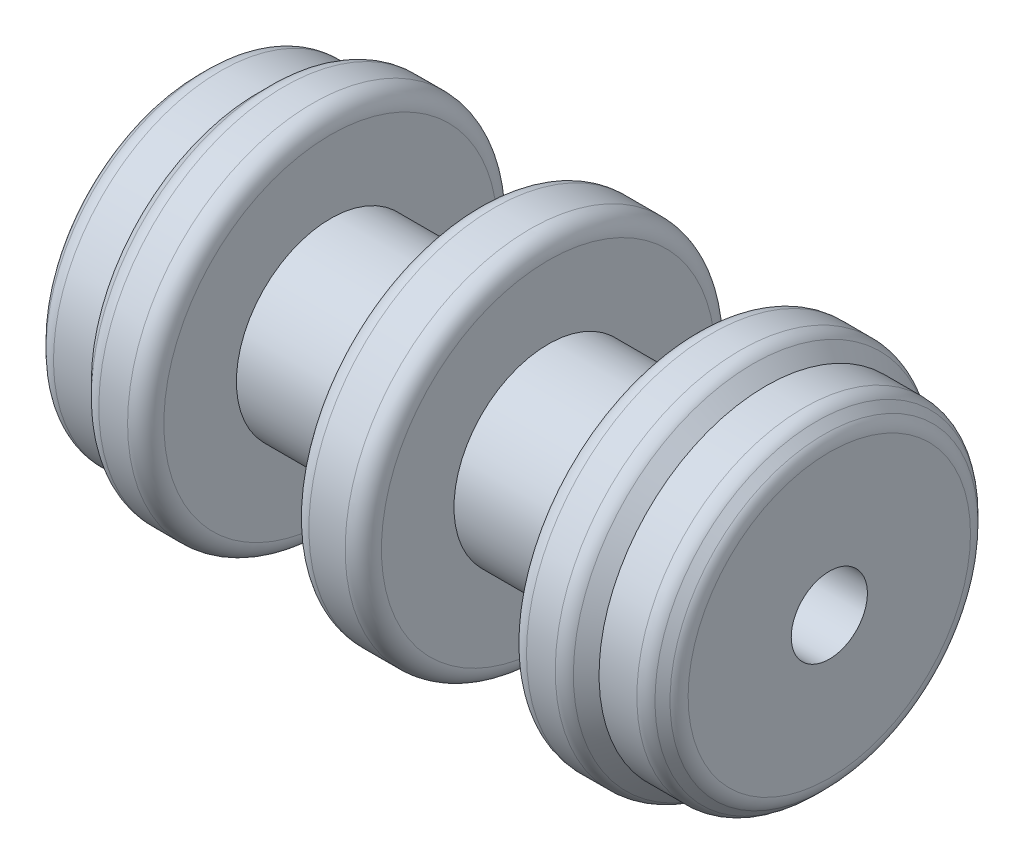
ISO-10303-21;
HEADER;
FILE_DESCRIPTION(('STEP AP214'),'2;1');
FILE_NAME('part.step','',(''),(''),'','','');
FILE_SCHEMA(('AUTOMOTIVE_DESIGN { 1 0 10303 214 1 1 1 1 }'));
ENDSEC;
DATA;
#1=APPLICATION_CONTEXT('core data for automotive mechanical design processes');
#2=APPLICATION_PROTOCOL_DEFINITION('international standard','automotive_design',2000,#1);
#3=PRODUCT_CONTEXT('',#1,'mechanical');
#4=PRODUCT('Part','Part','',(#3));
#5=PRODUCT_RELATED_PRODUCT_CATEGORY('part','',(#4));
#6=PRODUCT_DEFINITION_FORMATION('','',#4);
#7=PRODUCT_DEFINITION_CONTEXT('part definition',#1,'design');
#8=PRODUCT_DEFINITION('design','',#6,#7);
#9=PRODUCT_DEFINITION_SHAPE('','',#8);
#10=(LENGTH_UNIT() NAMED_UNIT(*) SI_UNIT(.MILLI.,.METRE.));
#11=(NAMED_UNIT(*) PLANE_ANGLE_UNIT() SI_UNIT($,.RADIAN.));
#12=(NAMED_UNIT(*) SI_UNIT($,.STERADIAN.) SOLID_ANGLE_UNIT());
#13=UNCERTAINTY_MEASURE_WITH_UNIT(LENGTH_MEASURE(1.E-05),#10,'distance_accuracy_value','');
#14=(GEOMETRIC_REPRESENTATION_CONTEXT(3) GLOBAL_UNCERTAINTY_ASSIGNED_CONTEXT((#13)) GLOBAL_UNIT_ASSIGNED_CONTEXT((#10,
#11,#12)) REPRESENTATION_CONTEXT('',''));
#15=CARTESIAN_POINT('',(0.,0.,0.));
#16=DIRECTION('',(0.,0.,1.));
#17=DIRECTION('',(1.,0.,0.));
#18=AXIS2_PLACEMENT_3D('',#15,#16,#17);
#19=CARTESIAN_POINT('',(-8.25,0.,0.));
#20=DIRECTION('',(1.,0.,0.));
#21=DIRECTION('',(0.,0.,-1.));
#22=AXIS2_PLACEMENT_3D('',#19,#20,#21);
#23=TOROIDAL_SURFACE('',#22,3.892894453143,0.5);
#24=CARTESIAN_POINT('',(-8.60355344197777,0.,0.));
#25=DIRECTION('',(-1.,0.,0.));
#26=DIRECTION('',(0.,-0.999935138433607,-0.0113894216605901));
#27=AXIS2_PLACEMENT_3D('',#24,#25,#26);
#28=CIRCLE('',#27,4.24644779235177);
#29=CARTESIAN_POINT('',(-8.60355344197777,-4.24617236109635,-0.0483645844667762));
#30=VERTEX_POINT('',#29);
#31=EDGE_CURVE('E11',#30,#30,#28,.T.);
#32=ORIENTED_EDGE('',*,*,#31,.T.);
#33=EDGE_LOOP('',(#32));
#34=FACE_BOUND('',#33,.T.);
#35=CARTESIAN_POINT('',(-8.7500000001062,0.0381910115030645,7.7677245975403E-05));
#36=DIRECTION('',(1.,-2.75511514165543E-11,-1.57897898423388E-13));
#37=DIRECTION('',(2.75511482294565E-11,0.999999999797006,-2.01491290041326E-05));
#38=AXIS2_PLACEMENT_3D('',#35,#36,#37);
#39=CIRCLE('',#38,3.85470344242242);
#40=CARTESIAN_POINT('',(-8.75,3.892894453143,8.32904135952587E-09));
#41=VERTEX_POINT('',#40);
#42=CARTESIAN_POINT('',(-8.75,3.89264034580401,0.0443377984638292));
#43=VERTEX_POINT('',#42);
#44=EDGE_CURVE('E258',#41,#43,#39,.T.);
#45=ORIENTED_EDGE('',*,*,#44,.T.);
#46=CARTESIAN_POINT('',(-8.75,-8.09144607978422E-07,8.80616942214307E-07));
#47=DIRECTION('',(1.,0.,0.));
#48=DIRECTION('',(0.,0.999935141035701,0.0113891932072789));
#49=AXIS2_PLACEMENT_3D('',#46,#47,#48);
#50=CIRCLE('',#49,3.89289364399849);
#51=CARTESIAN_POINT('',(-8.75,-3.892894453143,-1.06837358044408E-08));
#52=VERTEX_POINT('',#51);
#53=EDGE_CURVE('E260',#43,#52,#50,.T.);
#54=ORIENTED_EDGE('',*,*,#53,.T.);
#55=CARTESIAN_POINT('',(-8.75000046407109,0.127174847370546,0.00101587679354959));
#56=DIRECTION('',(1.,1.15438382892325E-07,7.82455278567624E-10));
#57=DIRECTION('',(1.15438576935968E-07,-0.999999968070346,-0.000252703963267171));
#58=AXIS2_PLACEMENT_3D('',#55,#56,#57);
#59=CIRCLE('',#58,4.02006942887297);
#60=CARTESIAN_POINT('',(-8.74999999999483,-3.89263873770959,-0.0443377797739686));
#61=VERTEX_POINT('',#60);
#62=EDGE_CURVE('E266',#52,#61,#59,.T.);
#63=ORIENTED_EDGE('',*,*,#62,.T.);
#64=CARTESIAN_POINT('',(-8.75000000069379,2.28907337084926E-06,-0.000119548526096862));
#65=DIRECTION('',(1.,-1.79189333308281E-10,3.15816161693005E-08));
#66=DIRECTION('',(1.79548630367821E-10,-0.999935487778274,-0.0113587095052725));
#67=AXIS2_PLACEMENT_3D('',#64,#65,#66);
#68=CIRCLE('',#67,3.89289216590552);
#69=EDGE_CURVE('E254',#61,#41,#68,.T.);
#70=ORIENTED_EDGE('',*,*,#69,.T.);
#71=EDGE_LOOP('',(#45,#54,#63,#70));
#72=FACE_BOUND('',#71,.T.);
#73=ADVANCED_FACE('F16',(#34,#72),#23,.T.);
#74=CARTESIAN_POINT('',(8.25,0.,0.));
#75=DIRECTION('',(-1.,0.,0.));
#76=DIRECTION('',(0.,0.,1.));
#77=AXIS2_PLACEMENT_3D('',#74,#75,#76);
#78=TOROIDAL_SURFACE('',#77,3.892894321484,0.5);
#79=CARTESIAN_POINT('',(8.60355343649677,0.,0.));
#80=DIRECTION('',(1.,0.,0.));
#81=DIRECTION('',(0.,-0.99993513843578,0.0113894214698698));
#82=AXIS2_PLACEMENT_3D('',#79,#80,#81);
#83=CIRCLE('',#82,4.24644766617377);
#84=CARTESIAN_POINT('',(8.60355343649677,-4.24617223493576,0.0483645822197979));
#85=VERTEX_POINT('',#84);
#86=EDGE_CURVE('E291',#85,#85,#83,.T.);
#87=ORIENTED_EDGE('',*,*,#86,.T.);
#88=EDGE_LOOP('',(#87));
#89=FACE_BOUND('',#88,.T.);
#90=CARTESIAN_POINT('',(8.75,-0.17824437632021,0.00114709993666735));
#91=DIRECTION('',(1.,0.,0.));
#92=DIRECTION('',(0.,0.999937585401855,-0.0111725243659251));
#93=AXIS2_PLACEMENT_3D('',#90,#91,#92);
#94=CIRCLE('',#93,4.0711388594082);
#95=CARTESIAN_POINT('',(8.75,3.89264038459209,-0.0443377981671355));
#96=VERTEX_POINT('',#95);
#97=CARTESIAN_POINT('',(8.75,3.892894321484,5.96614364945702E-09));
#98=VERTEX_POINT('',#97);
#99=EDGE_CURVE('E371',#96,#98,#94,.T.);
#100=ORIENTED_EDGE('',*,*,#99,.F.);
#101=CARTESIAN_POINT('',(8.75,-4.25220619197468E-06,-0.000620433030791134));
#102=DIRECTION('',(1.,0.,0.));
#103=DIRECTION('',(0.,-0.999999987299984,0.000159373872441358));
#104=AXIS2_PLACEMENT_3D('',#101,#102,#103);
#105=CIRCLE('',#104,3.89289011871757);
#106=CARTESIAN_POINT('',(8.75,-3.892894321484,-8.05758241517806E-09));
#107=VERTEX_POINT('',#106);
#108=EDGE_CURVE('E345',#107,#96,#105,.T.);
#109=ORIENTED_EDGE('',*,*,#108,.F.);
#110=CARTESIAN_POINT('',(8.7499998933619,0.14256465399667,-0.00107361043085454));
#111=DIRECTION('',(1.,2.64252571959978E-08,-5.89284578225665E-11));
#112=DIRECTION('',(2.64242471277992E-08,-0.999936681958073,0.0112530917831472));
#113=AXIS2_PLACEMENT_3D('',#110,#111,#112);
#114=CIRCLE('',#113,4.03545911829244);
#115=CARTESIAN_POINT('',(8.74999999999586,-3.89263894692612,0.0443377814144284));
#116=VERTEX_POINT('',#115);
#117=EDGE_CURVE('E341',#116,#107,#114,.T.);
#118=ORIENTED_EDGE('',*,*,#117,.F.);
#119=CARTESIAN_POINT('',(8.74999999999792,4.97456838742527E-06,0.000621040176847112));
#120=DIRECTION('',(1.,-5.33916364426522E-13,-4.48611356518852E-13));
#121=DIRECTION('',(5.33844790482363E-13,0.999999987275025,-0.000159530402088842));
#122=AXIS2_PLACEMENT_3D('',#119,#120,#121);
#123=CIRCLE('',#122,3.89288939645253);
#124=EDGE_CURVE('E319',#98,#116,#123,.T.);
#125=ORIENTED_EDGE('',*,*,#124,.F.);
#126=EDGE_LOOP('',(#100,#109,#118,#125));
#127=FACE_BOUND('',#126,.T.);
#128=ADVANCED_FACE('F528',(#89,#127),#78,.T.);
#129=CARTESIAN_POINT('',(-8.042894513343,0.,0.));
#130=DIRECTION('',(1.,0.,0.));
#131=DIRECTION('',(0.,0.,-1.));
#132=AXIS2_PLACEMENT_3D('',#129,#130,#131);
#133=TOROIDAL_SURFACE('',#132,4.1,0.499999999999992);
#134=CARTESIAN_POINT('',(-8.042894513343,0.,0.));
#135=DIRECTION('',(-1.,0.,0.));
#136=DIRECTION('',(0.,0.999968417387247,-0.00794759259425538));
#137=AXIS2_PLACEMENT_3D('',#134,#135,#136);
#138=CIRCLE('',#137,4.6);
#139=CARTESIAN_POINT('',(-8.042894513343,4.59985471998134,-0.0365589259335747));
#140=VERTEX_POINT('',#139);
#141=EDGE_CURVE('E301',#140,#140,#138,.T.);
#142=ORIENTED_EDGE('',*,*,#141,.T.);
#143=EDGE_LOOP('',(#142));
#144=FACE_BOUND('',#143,.T.);
#145=CARTESIAN_POINT('',(-8.39644795536287,0.,0.));
#146=DIRECTION('',(-1.,0.,0.));
#147=DIRECTION('',(0.,0.,-1.));
#148=AXIS2_PLACEMENT_3D('',#145,#146,#147);
#149=CIRCLE('',#148,4.45355333920361);
#150=CARTESIAN_POINT('',(-8.39644795536287,0.,-4.45355333920361));
#151=VERTEX_POINT('',#150);
#152=EDGE_CURVE('E27',#151,#151,#149,.T.);
#153=ORIENTED_EDGE('',*,*,#152,.F.);
#154=EDGE_LOOP('',(#153));
#155=FACE_BOUND('',#154,.T.);
#156=ADVANCED_FACE('F522',(#144,#155),#133,.T.);
#157=CARTESIAN_POINT('',(8.042894375263,0.,0.));
#158=DIRECTION('',(1.,0.,0.));
#159=DIRECTION('',(0.,0.,-1.));
#160=AXIS2_PLACEMENT_3D('',#157,#158,#159);
#161=TOROIDAL_SURFACE('',#160,4.1,0.5);
#162=CARTESIAN_POINT('',(8.3964478117764,0.,0.));
#163=DIRECTION('',(1.,0.,0.));
#164=DIRECTION('',(0.,0.,-1.));
#165=AXIS2_PLACEMENT_3D('',#162,#163,#164);
#166=CIRCLE('',#165,4.45355334466058);
#167=CARTESIAN_POINT('',(8.3964478117764,0.,-4.45355334466058));
#168=VERTEX_POINT('',#167);
#169=EDGE_CURVE('E293',#168,#168,#166,.T.);
#170=ORIENTED_EDGE('',*,*,#169,.F.);
#171=EDGE_LOOP('',(#170));
#172=FACE_BOUND('',#171,.T.);
#173=CARTESIAN_POINT('',(8.042894375263,0.,0.));
#174=DIRECTION('',(1.,0.,0.));
#175=DIRECTION('',(0.,0.999973425875417,0.00729023614034013));
#176=AXIS2_PLACEMENT_3D('',#173,#174,#175);
#177=CIRCLE('',#176,4.6);
#178=CARTESIAN_POINT('',(8.042894375263,4.59987775902692,0.0335350862455646));
#179=VERTEX_POINT('',#178);
#180=EDGE_CURVE('E217',#179,#179,#177,.T.);
#181=ORIENTED_EDGE('',*,*,#180,.T.);
#182=EDGE_LOOP('',(#181));
#183=FACE_BOUND('',#182,.T.);
#184=ADVANCED_FACE('F527',(#172,#183),#161,.T.);
#185=CARTESIAN_POINT('',(-6.292893218813,0.,0.));
#186=DIRECTION('',(1.,0.,0.));
#187=DIRECTION('',(0.,0.,-1.));
#188=AXIS2_PLACEMENT_3D('',#185,#186,#187);
#189=TOROIDAL_SURFACE('',#188,4.6,0.500000000000008);
#190=CARTESIAN_POINT('',(-6.292893218813,0.,0.));
#191=DIRECTION('',(-1.,0.,0.));
#192=DIRECTION('',(0.,-0.999976094856996,-0.00691445692387086));
#193=AXIS2_PLACEMENT_3D('',#190,#191,#192);
#194=CIRCLE('',#193,5.1);
#195=CARTESIAN_POINT('',(-6.292893218813,-5.09987808377068,-0.0352637303117414));
#196=VERTEX_POINT('',#195);
#197=EDGE_CURVE('E107',#196,#196,#194,.T.);
#198=ORIENTED_EDGE('',*,*,#197,.T.);
#199=EDGE_LOOP('',(#198));
#200=FACE_BOUND('',#199,.T.);
#201=CARTESIAN_POINT('',(-6.6464466093521,0.,0.));
#202=DIRECTION('',(-1.,0.,0.));
#203=DIRECTION('',(0.,-1.,0.));
#204=AXIS2_PLACEMENT_3D('',#201,#202,#203);
#205=CIRCLE('',#204,4.95355339057824);
#206=CARTESIAN_POINT('',(-6.6464466093521,-4.95355339057824,0.));
#207=VERTEX_POINT('',#206);
#208=EDGE_CURVE('E357',#207,#207,#205,.T.);
#209=ORIENTED_EDGE('',*,*,#208,.F.);
#210=EDGE_LOOP('',(#209));
#211=FACE_BOUND('',#210,.T.);
#212=ADVANCED_FACE('F638',(#200,#211),#189,.T.);
#213=CARTESIAN_POINT('',(6.29289321881301,0.,0.));
#214=DIRECTION('',(1.,0.,0.));
#215=DIRECTION('',(0.,0.,-1.));
#216=AXIS2_PLACEMENT_3D('',#213,#214,#215);
#217=TOROIDAL_SURFACE('',#216,4.6,0.499999999999986);
#218=CARTESIAN_POINT('',(6.6464466093521,0.,0.));
#219=DIRECTION('',(1.,0.,0.));
#220=DIRECTION('',(0.,1.,0.));
#221=AXIS2_PLACEMENT_3D('',#218,#219,#220);
#222=CIRCLE('',#221,4.95355339057824);
#223=CARTESIAN_POINT('',(6.6464466093521,4.95355339057824,0.));
#224=VERTEX_POINT('',#223);
#225=EDGE_CURVE('E312',#224,#224,#222,.T.);
#226=ORIENTED_EDGE('',*,*,#225,.F.);
#227=EDGE_LOOP('',(#226));
#228=FACE_BOUND('',#227,.T.);
#229=CARTESIAN_POINT('',(6.292893218813,0.,0.));
#230=DIRECTION('',(1.,0.,0.));
#231=DIRECTION('',(0.,0.999978381048036,0.00657551796802924));
#232=AXIS2_PLACEMENT_3D('',#229,#230,#231);
#233=CIRCLE('',#232,5.1);
#234=CARTESIAN_POINT('',(6.292893218813,5.09988974334499,0.0335351416369491));
#235=VERTEX_POINT('',#234);
#236=EDGE_CURVE('E351',#235,#235,#233,.T.);
#237=ORIENTED_EDGE('',*,*,#236,.T.);
#238=EDGE_LOOP('',(#237));
#239=FACE_BOUND('',#238,.T.);
#240=ADVANCED_FACE('F632',(#228,#239),#217,.T.);
#241=CARTESIAN_POINT('',(-5.5,0.,0.));
#242=DIRECTION('',(1.,0.,0.));
#243=DIRECTION('',(0.,0.,-1.));
#244=AXIS2_PLACEMENT_3D('',#241,#242,#243);
#245=TOROIDAL_SURFACE('',#244,4.6,0.5);
#246=CARTESIAN_POINT('',(-5.,-8.60639115204433E-07,9.39716608564303E-07));
#247=DIRECTION('',(-1.,0.,0.));
#248=DIRECTION('',(0.,-0.999999999999979,-2.04286257513174E-07));
#249=AXIS2_PLACEMENT_3D('',#246,#247,#248);
#250=CIRCLE('',#249,4.59999913936098);
#251=CARTESIAN_POINT('',(-5.,-4.6,0.));
#252=VERTEX_POINT('',#251);
#253=CARTESIAN_POINT('',(-5.,4.59989883777754,0.0302473713753235));
#254=VERTEX_POINT('',#253);
#255=EDGE_CURVE('E329',#252,#254,#250,.T.);
#256=ORIENTED_EDGE('',*,*,#255,.T.);
#257=CARTESIAN_POINT('',(-4.99999999969179,0.120181614794313,0.000141118722733426));
#258=DIRECTION('',(-1.,-6.88004579931393E-11,-2.30102573919844E-13));
#259=DIRECTION('',(-6.88004507084842E-11,0.999977417735186,0.006720418117189));
#260=AXIS2_PLACEMENT_3D('',#257,#258,#259);
#261=CIRCLE('',#260,4.47981838742838);
#262=CARTESIAN_POINT('',(-5.,4.6,0.));
#263=VERTEX_POINT('',#262);
#264=EDGE_CURVE('E69',#254,#263,#261,.T.);
#265=ORIENTED_EDGE('',*,*,#264,.T.);
#266=CARTESIAN_POINT('',(-4.99999999991786,1.31880826116475E-06,0.000120541578642981));
#267=DIRECTION('',(-1.,-1.77104639971205E-11,5.58131300833015E-09));
#268=DIRECTION('',(-1.78567206157317E-11,0.999999999656657,-2.62046985133696E-05));
#269=AXIS2_PLACEMENT_3D('',#266,#267,#268);
#270=CIRCLE('',#269,4.59999868277112);
#271=CARTESIAN_POINT('',(-5.00000000000588,-4.59989712501686,-0.0302470067458492));
#272=VERTEX_POINT('',#271);
#273=EDGE_CURVE('E55',#263,#272,#270,.T.);
#274=ORIENTED_EDGE('',*,*,#273,.T.);
#275=CARTESIAN_POINT('',(-4.99999931062655,-0.0340611734194487,0.000405821301024528));
#276=DIRECTION('',(-0.999999999999988,1.5098168929867E-07,7.08050913941013E-10));
#277=DIRECTION('',(-1.50983040346389E-07,-0.999977465090659,-0.00671336806953142));
#278=AXIS2_PLACEMENT_3D('',#275,#276,#277);
#279=CIRCLE('',#278,4.56593884461533);
#280=EDGE_CURVE('E360',#272,#252,#279,.T.);
#281=ORIENTED_EDGE('',*,*,#280,.T.);
#282=EDGE_LOOP('',(#256,#265,#274,#281));
#283=FACE_BOUND('',#282,.T.);
#284=CARTESIAN_POINT('',(-5.5,0.,0.));
#285=DIRECTION('',(-1.,0.,0.));
#286=DIRECTION('',(0.,0.,-1.));
#287=AXIS2_PLACEMENT_3D('',#284,#285,#286);
#288=CIRCLE('',#287,5.1);
#289=CARTESIAN_POINT('',(-5.5,0.,-5.1));
#290=VERTEX_POINT('',#289);
#291=EDGE_CURVE('E97',#290,#290,#288,.T.);
#292=ORIENTED_EDGE('',*,*,#291,.F.);
#293=EDGE_LOOP('',(#292));
#294=FACE_BOUND('',#293,.T.);
#295=ADVANCED_FACE('F637',(#283,#294),#245,.T.);
#296=CARTESIAN_POINT('',(5.5,-1.80411241501588E-13,-2.52306584912904E-11));
#297=DIRECTION('',(1.,0.,0.));
#298=DIRECTION('',(0.,0.,-1.));
#299=AXIS2_PLACEMENT_3D('',#296,#297,#298);
#300=TOROIDAL_SURFACE('',#299,4.6,0.5);
#301=CARTESIAN_POINT('',(5.5,0.,0.));
#302=DIRECTION('',(1.,0.,0.));
#303=DIRECTION('',(0.,0.,-1.));
#304=AXIS2_PLACEMENT_3D('',#301,#302,#303);
#305=CIRCLE('',#304,5.1);
#306=CARTESIAN_POINT('',(5.5,0.,-5.1));
#307=VERTEX_POINT('',#306);
#308=EDGE_CURVE('E354',#307,#307,#305,.T.);
#309=ORIENTED_EDGE('',*,*,#308,.F.);
#310=EDGE_LOOP('',(#309));
#311=FACE_BOUND('',#310,.T.);
#312=CARTESIAN_POINT('',(5.,-8.19943433354002E-07,-8.94878874561217E-07));
#313=DIRECTION('',(1.,0.,0.));
#314=DIRECTION('',(0.,-0.999999999999981,1.94538920548862E-07));
#315=AXIS2_PLACEMENT_3D('',#312,#313,#314);
#316=CIRCLE('',#315,4.59999918005665);
#317=CARTESIAN_POINT('',(5.,-4.6,0.));
#318=VERTEX_POINT('',#317);
#319=CARTESIAN_POINT('',(5.,4.59988017634771,-0.0329747706216577));
#320=VERTEX_POINT('',#319);
#321=EDGE_CURVE('E289',#318,#320,#316,.T.);
#322=ORIENTED_EDGE('',*,*,#321,.T.);
#323=CARTESIAN_POINT('',(5.,0.0968121992466716,-0.000123928637349288));
#324=DIRECTION('',(1.,0.,0.));
#325=DIRECTION('',(0.,0.9999733909926,-0.00729501931195782));
#326=AXIS2_PLACEMENT_3D('',#323,#324,#325);
#327=CIRCLE('',#326,4.5031878024586);
#328=CARTESIAN_POINT('',(5.,4.6,0.));
#329=VERTEX_POINT('',#328);
#330=EDGE_CURVE('E330',#320,#329,#327,.T.);
#331=ORIENTED_EDGE('',*,*,#330,.T.);
#332=CARTESIAN_POINT('',(4.99999999999924,1.75460774967488E-06,3.38188399931841E-05));
#333=DIRECTION('',(1.,-1.65951249983755E-13,-2.08050400940527E-10));
#334=DIRECTION('',(1.64421679130652E-13,0.999999999972975,-7.35192454185911E-06));
#335=AXIS2_PLACEMENT_3D('',#332,#333,#334);
#336=CIRCLE('',#335,4.59999824551657);
#337=CARTESIAN_POINT('',(5.00000000000534,-4.59987848806441,0.0329824429357779));
#338=VERTEX_POINT('',#337);
#339=EDGE_CURVE('E348',#329,#338,#336,.T.);
#340=ORIENTED_EDGE('',*,*,#339,.T.);
#341=CARTESIAN_POINT('',(4.9999991159643,0.171285108792855,-0.00108663676930126));
#342=DIRECTION('',(0.999999999999983,1.85282321088541E-07,-8.44389329618358E-10));
#343=DIRECTION('',(1.8528362694789E-07,-0.999974506727677,0.00714044079209377));
#344=AXIS2_PLACEMENT_3D('',#341,#342,#343);
#345=CIRCLE('',#344,4.77128523253103);
#346=EDGE_CURVE('E20',#338,#318,#345,.T.);
#347=ORIENTED_EDGE('',*,*,#346,.T.);
#348=EDGE_LOOP('',(#322,#331,#340,#347));
#349=FACE_BOUND('',#348,.T.);
#350=ADVANCED_FACE('F652',(#311,#349),#300,.T.);
#351=CARTESIAN_POINT('',(-0.5,1.80411241501588E-13,2.52295200790092E-11));
#352=DIRECTION('',(1.,0.,0.));
#353=DIRECTION('',(0.,0.,-1.));
#354=AXIS2_PLACEMENT_3D('',#351,#352,#353);
#355=TOROIDAL_SURFACE('',#354,4.6,0.5);
#356=CARTESIAN_POINT('',(-0.5,0.,0.));
#357=DIRECTION('',(-1.,0.,0.));
#358=DIRECTION('',(0.,0.999974306468982,-0.00716843092171987));
#359=AXIS2_PLACEMENT_3D('',#356,#357,#358);
#360=CIRCLE('',#359,5.1);
#361=CARTESIAN_POINT('',(-0.5,5.09986896299181,-0.0365589977007713));
#362=VERTEX_POINT('',#361);
#363=EDGE_CURVE('E334',#362,#362,#360,.T.);
#364=ORIENTED_EDGE('',*,*,#363,.T.);
#365=EDGE_LOOP('',(#364));
#366=FACE_BOUND('',#365,.T.);
#367=CARTESIAN_POINT('',(-1.,8.19943431836119E-07,8.94878875211738E-07));
#368=DIRECTION('',(1.,0.,0.));
#369=DIRECTION('',(0.,0.999999999999981,-1.94538920756864E-07));
#370=AXIS2_PLACEMENT_3D('',#367,#368,#369);
#371=CIRCLE('',#370,4.59999918005666);
#372=CARTESIAN_POINT('',(-1.,4.6,0.));
#373=VERTEX_POINT('',#372);
#374=CARTESIAN_POINT('',(-1.,-4.59988017634771,0.0329747706216559));
#375=VERTEX_POINT('',#374);
#376=EDGE_CURVE('E287',#373,#375,#371,.T.);
#377=ORIENTED_EDGE('',*,*,#376,.T.);
#378=CARTESIAN_POINT('',(-1.,-0.0968121992577951,0.000123928637629242));
#379=DIRECTION('',(1.,0.,0.));
#380=DIRECTION('',(0.,-0.9999733909926,0.00729501931191328));
#381=AXIS2_PLACEMENT_3D('',#378,#379,#380);
#382=CIRCLE('',#381,4.50318780244748);
#383=CARTESIAN_POINT('',(-1.,-4.6,0.));
#384=VERTEX_POINT('',#383);
#385=EDGE_CURVE('E284',#375,#384,#382,.T.);
#386=ORIENTED_EDGE('',*,*,#385,.T.);
#387=CARTESIAN_POINT('',(-1.00000000000076,-1.75460774967488E-06,-3.38188399931841E-05));
#388=DIRECTION('',(1.,1.65951247219068E-13,2.08050024891428E-10));
#389=DIRECTION('',(1.64421679130652E-13,-0.999999999972975,7.35192454185027E-06));
#390=AXIS2_PLACEMENT_3D('',#387,#388,#389);
#391=CIRCLE('',#390,4.59999824551657);
#392=CARTESIAN_POINT('',(-0.999999999994664,4.59987848806441,-0.0329824429357779));
#393=VERTEX_POINT('',#392);
#394=EDGE_CURVE('E288',#384,#393,#391,.T.);
#395=ORIENTED_EDGE('',*,*,#394,.T.);
#396=CARTESIAN_POINT('',(-1.0000008841496,-0.171285108792762,0.00108663676930091));
#397=DIRECTION('',(0.999999999999983,-1.85306194181223E-07,8.44464132556494E-10));
#398=DIRECTION('',(1.85307499966095E-07,0.999974506727677,-0.00714044079209384));
#399=AXIS2_PLACEMENT_3D('',#396,#397,#398);
#400=CIRCLE('',#399,4.77128523253094);
#401=EDGE_CURVE('E163',#393,#373,#400,.T.);
#402=ORIENTED_EDGE('',*,*,#401,.T.);
#403=EDGE_LOOP('',(#377,#386,#395,#402));
#404=FACE_BOUND('',#403,.T.);
#405=ADVANCED_FACE('F609',(#366,#404),#355,.T.);
#406=CARTESIAN_POINT('',(0.5,0.,0.));
#407=DIRECTION('',(1.,0.,0.));
#408=DIRECTION('',(0.,0.,-1.));
#409=AXIS2_PLACEMENT_3D('',#406,#407,#408);
#410=TOROIDAL_SURFACE('',#409,4.6,0.5);
#411=CARTESIAN_POINT('',(1.,3.28965994635805E-06,-0.000739739318539366));
#412=DIRECTION('',(1.,0.,0.));
#413=DIRECTION('',(0.,-0.999979425554593,-0.00641470712553117));
#414=AXIS2_PLACEMENT_3D('',#411,#412,#413);
#415=CIRCLE('',#414,4.59999676981991);
#416=CARTESIAN_POINT('',(1.,-4.59989883777755,-0.0302473713753235));
#417=VERTEX_POINT('',#416);
#418=CARTESIAN_POINT('',(1.,4.6,0.));
#419=VERTEX_POINT('',#418);
#420=EDGE_CURVE('E282',#417,#419,#415,.T.);
#421=ORIENTED_EDGE('',*,*,#420,.F.);
#422=CARTESIAN_POINT('',(1.,0.293857113482783,0.00124363228280322));
#423=DIRECTION('',(1.,0.,0.));
#424=DIRECTION('',(0.,-0.999999967711238,-0.000254121077466993));
#425=AXIS2_PLACEMENT_3D('',#422,#423,#424);
#426=CIRCLE('',#425,4.89385727149937);
#427=CARTESIAN_POINT('',(1.,-4.6,0.));
#428=VERTEX_POINT('',#427);
#429=EDGE_CURVE('E278',#428,#417,#426,.T.);
#430=ORIENTED_EDGE('',*,*,#429,.F.);
#431=CARTESIAN_POINT('',(0.999999999997051,-4.14958248296481E-06,0.000740463672080274));
#432=DIRECTION('',(1.,6.41272633160707E-13,-5.4020980553263E-13));
#433=DIRECTION('',(-6.37794279851195E-13,0.999979427065495,0.00641447158889154));
#434=AXIS2_PLACEMENT_3D('',#431,#432,#433);
#435=CIRCLE('',#434,4.59999591001392);
#436=CARTESIAN_POINT('',(0.999999999994117,4.59989712501686,0.0302470067458819));
#437=VERTEX_POINT('',#436);
#438=EDGE_CURVE('E283',#437,#428,#435,.T.);
#439=ORIENTED_EDGE('',*,*,#438,.F.);
#440=CARTESIAN_POINT('',(0.999999545186813,-0.166825229368701,-0.00108906858798957));
#441=DIRECTION('',(1.,-9.54121503610523E-08,-1.30003233858499E-10));
#442=DIRECTION('',(9.5412177572522E-08,0.999999973901108,0.00022846832161088));
#443=AXIS2_PLACEMENT_3D('',#440,#441,#442);
#444=CIRCLE('',#443,4.76682535377756);
#445=EDGE_CURVE('E320',#419,#437,#444,.T.);
#446=ORIENTED_EDGE('',*,*,#445,.F.);
#447=EDGE_LOOP('',(#421,#430,#439,#446));
#448=FACE_BOUND('',#447,.T.);
#449=CARTESIAN_POINT('',(0.5,0.,0.));
#450=DIRECTION('',(1.,0.,0.));
#451=DIRECTION('',(0.,0.999978381048036,0.00657551796802924));
#452=AXIS2_PLACEMENT_3D('',#449,#450,#451);
#453=CIRCLE('',#452,5.1);
#454=CARTESIAN_POINT('',(0.5,5.09988974334499,0.0335351416369491));
#455=VERTEX_POINT('',#454);
#456=EDGE_CURVE('E331',#455,#455,#453,.T.);
#457=ORIENTED_EDGE('',*,*,#456,.T.);
#458=EDGE_LOOP('',(#457));
#459=FACE_BOUND('',#458,.T.);
#460=ADVANCED_FACE('F603',(#448,#459),#410,.T.);
#461=CARTESIAN_POINT('',(-8.75,0.,0.));
#462=DIRECTION('',(-1.,0.,0.));
#463=DIRECTION('',(0.,0.,1.));
#464=AXIS2_PLACEMENT_3D('',#461,#462,#463);
#465=CYLINDRICAL_SURFACE('',#464,1.05);
#466=CARTESIAN_POINT('',(8.75,0.,0.));
#467=DIRECTION('',(-1.,0.,0.));
#468=DIRECTION('',(0.,0.,1.));
#469=AXIS2_PLACEMENT_3D('',#466,#467,#468);
#470=CIRCLE('',#469,1.05);
#471=CARTESIAN_POINT('',(8.75,0.,1.05));
#472=VERTEX_POINT('',#471);
#473=EDGE_CURVE('E273',#472,#472,#470,.T.);
#474=ORIENTED_EDGE('',*,*,#473,.F.);
#475=EDGE_LOOP('',(#474));
#476=FACE_BOUND('',#475,.T.);
#477=CARTESIAN_POINT('',(-8.75,0.,0.));
#478=DIRECTION('',(1.,0.,0.));
#479=DIRECTION('',(0.,0.,1.));
#480=AXIS2_PLACEMENT_3D('',#477,#478,#479);
#481=CIRCLE('',#480,1.05);
#482=CARTESIAN_POINT('',(-8.75,0.,1.05));
#483=VERTEX_POINT('',#482);
#484=EDGE_CURVE('E335',#483,#483,#481,.T.);
#485=ORIENTED_EDGE('',*,*,#484,.F.);
#486=EDGE_LOOP('',(#485));
#487=FACE_BOUND('',#486,.T.);
#488=ADVANCED_FACE('F608',(#476,#487),#465,.F.);
#489=CARTESIAN_POINT('',(-8.3964479555334,0.,0.));
#490=DIRECTION('',(1.,0.,0.));
#491=DIRECTION('',(0.,0.,-1.));
#492=AXIS2_PLACEMENT_3D('',#489,#490,#491);
#493=CONICAL_SURFACE('',#492,4.45355333903308,0.785398308727185);
#494=ORIENTED_EDGE('',*,*,#31,.F.);
#495=EDGE_LOOP('',(#494));
#496=FACE_BOUND('',#495,.T.);
#497=ORIENTED_EDGE('',*,*,#152,.T.);
#498=EDGE_LOOP('',(#497));
#499=FACE_BOUND('',#498,.T.);
#500=ADVANCED_FACE('F626',(#496,#499),#493,.T.);
#501=CARTESIAN_POINT('',(8.3964478117764,0.,0.));
#502=DIRECTION('',(-1.,0.,0.));
#503=DIRECTION('',(0.,0.,1.));
#504=AXIS2_PLACEMENT_3D('',#501,#502,#503);
#505=CONICAL_SURFACE('',#504,4.45355334466058,0.785398293219773);
#506=ORIENTED_EDGE('',*,*,#86,.F.);
#507=EDGE_LOOP('',(#506));
#508=FACE_BOUND('',#507,.T.);
#509=ORIENTED_EDGE('',*,*,#169,.T.);
#510=EDGE_LOOP('',(#509));
#511=FACE_BOUND('',#510,.T.);
#512=ADVANCED_FACE('F18',(#508,#511),#505,.T.);
#513=CARTESIAN_POINT('',(-9.625,0.,0.));
#514=DIRECTION('',(1.,0.,0.));
#515=DIRECTION('',(0.,0.,-1.));
#516=AXIS2_PLACEMENT_3D('',#513,#514,#515);
#517=CYLINDRICAL_SURFACE('',#516,4.6);
#518=ORIENTED_EDGE('',*,*,#141,.F.);
#519=EDGE_LOOP('',(#518));
#520=FACE_BOUND('',#519,.T.);
#521=CARTESIAN_POINT('',(-7.,0.,0.));
#522=DIRECTION('',(-1.,0.,0.));
#523=DIRECTION('',(0.,0.,-1.));
#524=AXIS2_PLACEMENT_3D('',#521,#522,#523);
#525=CIRCLE('',#524,4.6);
#526=CARTESIAN_POINT('',(-7.,0.,-4.6));
#527=VERTEX_POINT('',#526);
#528=EDGE_CURVE('E208',#527,#527,#525,.T.);
#529=ORIENTED_EDGE('',*,*,#528,.T.);
#530=EDGE_LOOP('',(#529));
#531=FACE_BOUND('',#530,.T.);
#532=ADVANCED_FACE('F734',(#520,#531),#517,.T.);
#533=CARTESIAN_POINT('',(-9.625,0.,0.));
#534=DIRECTION('',(1.,0.,0.));
#535=DIRECTION('',(0.,0.,-1.));
#536=AXIS2_PLACEMENT_3D('',#533,#534,#535);
#537=CYLINDRICAL_SURFACE('',#536,4.6);
#538=CARTESIAN_POINT('',(7.,0.,0.));
#539=DIRECTION('',(1.,0.,0.));
#540=DIRECTION('',(0.,0.,-1.));
#541=AXIS2_PLACEMENT_3D('',#538,#539,#540);
#542=CIRCLE('',#541,4.6);
#543=CARTESIAN_POINT('',(7.,0.,-4.6));
#544=VERTEX_POINT('',#543);
#545=EDGE_CURVE('E314',#544,#544,#542,.T.);
#546=ORIENTED_EDGE('',*,*,#545,.T.);
#547=EDGE_LOOP('',(#546));
#548=FACE_BOUND('',#547,.T.);
#549=ORIENTED_EDGE('',*,*,#180,.F.);
#550=EDGE_LOOP('',(#549));
#551=FACE_BOUND('',#550,.T.);
#552=ADVANCED_FACE('F548',(#548,#551),#537,.T.);
#553=CARTESIAN_POINT('',(-6.6464466093521,0.,0.));
#554=DIRECTION('',(1.,0.,0.));
#555=DIRECTION('',(0.,0.,-1.));
#556=AXIS2_PLACEMENT_3D('',#553,#554,#555);
#557=CONICAL_SURFACE('',#556,4.95355339057824,0.785398163397448);
#558=ORIENTED_EDGE('',*,*,#528,.F.);
#559=EDGE_LOOP('',(#558));
#560=FACE_BOUND('',#559,.T.);
#561=ORIENTED_EDGE('',*,*,#208,.T.);
#562=EDGE_LOOP('',(#561));
#563=FACE_BOUND('',#562,.T.);
#564=ADVANCED_FACE('F542',(#560,#563),#557,.T.);
#565=CARTESIAN_POINT('',(6.6464466093521,0.,0.));
#566=DIRECTION('',(-1.,0.,0.));
#567=DIRECTION('',(0.,0.,1.));
#568=AXIS2_PLACEMENT_3D('',#565,#566,#567);
#569=CONICAL_SURFACE('',#568,4.95355339057824,0.785398163397448);
#570=ORIENTED_EDGE('',*,*,#545,.F.);
#571=EDGE_LOOP('',(#570));
#572=FACE_BOUND('',#571,.T.);
#573=ORIENTED_EDGE('',*,*,#225,.T.);
#574=EDGE_LOOP('',(#573));
#575=FACE_BOUND('',#574,.T.);
#576=ADVANCED_FACE('F547',(#572,#575),#569,.T.);
#577=CARTESIAN_POINT('',(-9.625,0.,0.));
#578=DIRECTION('',(1.,0.,0.));
#579=DIRECTION('',(0.,0.,-1.));
#580=AXIS2_PLACEMENT_3D('',#577,#578,#579);
#581=CYLINDRICAL_SURFACE('',#580,5.1);
#582=ORIENTED_EDGE('',*,*,#197,.F.);
#583=EDGE_LOOP('',(#582));
#584=FACE_BOUND('',#583,.T.);
#585=ORIENTED_EDGE('',*,*,#291,.T.);
#586=EDGE_LOOP('',(#585));
#587=FACE_BOUND('',#586,.T.);
#588=ADVANCED_FACE('F576',(#584,#587),#581,.T.);
#589=CARTESIAN_POINT('',(-9.625,0.,0.));
#590=DIRECTION('',(1.,0.,0.));
#591=DIRECTION('',(0.,0.,-1.));
#592=AXIS2_PLACEMENT_3D('',#589,#590,#591);
#593=CYLINDRICAL_SURFACE('',#592,5.1);
#594=ORIENTED_EDGE('',*,*,#308,.T.);
#595=EDGE_LOOP('',(#594));
#596=FACE_BOUND('',#595,.T.);
#597=ORIENTED_EDGE('',*,*,#236,.F.);
#598=EDGE_LOOP('',(#597));
#599=FACE_BOUND('',#598,.T.);
#600=ADVANCED_FACE('F581',(#596,#599),#593,.T.);
#601=CARTESIAN_POINT('',(-31.42885213811,0.,0.));
#602=DIRECTION('',(1.,0.,0.));
#603=DIRECTION('',(0.,0.,-1.));
#604=AXIS2_PLACEMENT_3D('',#601,#602,#603);
#605=CYLINDRICAL_SURFACE('',#604,2.6);
#606=CARTESIAN_POINT('',(-5.,0.,0.));
#607=DIRECTION('',(-1.,0.,0.));
#608=DIRECTION('',(0.,0.,-1.));
#609=AXIS2_PLACEMENT_3D('',#606,#607,#608);
#610=CIRCLE('',#609,2.6);
#611=CARTESIAN_POINT('',(-5.,0.,-2.6));
#612=VERTEX_POINT('',#611);
#613=EDGE_CURVE('E316',#612,#612,#610,.T.);
#614=ORIENTED_EDGE('',*,*,#613,.F.);
#615=EDGE_LOOP('',(#614));
#616=FACE_BOUND('',#615,.T.);
#617=CARTESIAN_POINT('',(-1.,0.,0.));
#618=DIRECTION('',(-1.,0.,0.));
#619=DIRECTION('',(0.,0.,-1.));
#620=AXIS2_PLACEMENT_3D('',#617,#618,#619);
#621=CIRCLE('',#620,2.6);
#622=CARTESIAN_POINT('',(-1.,0.,-2.6));
#623=VERTEX_POINT('',#622);
#624=EDGE_CURVE('E151',#623,#623,#621,.T.);
#625=ORIENTED_EDGE('',*,*,#624,.T.);
#626=EDGE_LOOP('',(#625));
#627=FACE_BOUND('',#626,.T.);
#628=ADVANCED_FACE('F590',(#616,#627),#605,.T.);
#629=CARTESIAN_POINT('',(-31.42885213811,0.,0.));
#630=DIRECTION('',(1.,0.,0.));
#631=DIRECTION('',(0.,0.,-1.));
#632=AXIS2_PLACEMENT_3D('',#629,#630,#631);
#633=CYLINDRICAL_SURFACE('',#632,2.6);
#634=CARTESIAN_POINT('',(1.,0.,0.));
#635=DIRECTION('',(1.,0.,0.));
#636=DIRECTION('',(0.,0.,-1.));
#637=AXIS2_PLACEMENT_3D('',#634,#635,#636);
#638=CIRCLE('',#637,2.6);
#639=CARTESIAN_POINT('',(1.,0.,-2.6));
#640=VERTEX_POINT('',#639);
#641=EDGE_CURVE('E363',#640,#640,#638,.T.);
#642=ORIENTED_EDGE('',*,*,#641,.T.);
#643=EDGE_LOOP('',(#642));
#644=FACE_BOUND('',#643,.T.);
#645=CARTESIAN_POINT('',(5.,0.,0.));
#646=DIRECTION('',(-1.,0.,0.));
#647=DIRECTION('',(0.,0.,-1.));
#648=AXIS2_PLACEMENT_3D('',#645,#646,#647);
#649=CIRCLE('',#648,2.6);
#650=CARTESIAN_POINT('',(5.,0.,-2.6));
#651=VERTEX_POINT('',#650);
#652=EDGE_CURVE('E326',#651,#651,#649,.T.);
#653=ORIENTED_EDGE('',*,*,#652,.T.);
#654=EDGE_LOOP('',(#653));
#655=FACE_BOUND('',#654,.T.);
#656=ADVANCED_FACE('F560',(#644,#655),#633,.T.);
#657=CARTESIAN_POINT('',(-9.625,0.,0.));
#658=DIRECTION('',(1.,0.,0.));
#659=DIRECTION('',(0.,0.,-1.));
#660=AXIS2_PLACEMENT_3D('',#657,#658,#659);
#661=CYLINDRICAL_SURFACE('',#660,5.1);
#662=ORIENTED_EDGE('',*,*,#363,.F.);
#663=EDGE_LOOP('',(#662));
#664=FACE_BOUND('',#663,.T.);
#665=ORIENTED_EDGE('',*,*,#456,.F.);
#666=EDGE_LOOP('',(#665));
#667=FACE_BOUND('',#666,.T.);
#668=ADVANCED_FACE('F555',(#664,#667),#661,.T.);
#669=CARTESIAN_POINT('',(-8.75,0.,0.));
#670=DIRECTION('',(1.,0.,0.));
#671=DIRECTION('',(0.,1.,0.));
#672=AXIS2_PLACEMENT_3D('',#669,#670,#671);
#673=PLANE('',#672);
#674=ORIENTED_EDGE('',*,*,#484,.T.);
#675=EDGE_LOOP('',(#674));
#676=FACE_BOUND('',#675,.T.);
#677=ORIENTED_EDGE('',*,*,#62,.F.);
#678=ORIENTED_EDGE('',*,*,#53,.F.);
#679=ORIENTED_EDGE('',*,*,#44,.F.);
#680=ORIENTED_EDGE('',*,*,#69,.F.);
#681=EDGE_LOOP('',(#677,#678,#679,#680));
#682=FACE_BOUND('',#681,.T.);
#683=ADVANCED_FACE('F265',(#676,#682),#673,.F.);
#684=CARTESIAN_POINT('',(8.75,0.,0.));
#685=DIRECTION('',(1.,0.,0.));
#686=DIRECTION('',(0.,1.,0.));
#687=AXIS2_PLACEMENT_3D('',#684,#685,#686);
#688=PLANE('',#687);
#689=ORIENTED_EDGE('',*,*,#473,.T.);
#690=EDGE_LOOP('',(#689));
#691=FACE_BOUND('',#690,.T.);
#692=ORIENTED_EDGE('',*,*,#124,.T.);
#693=ORIENTED_EDGE('',*,*,#117,.T.);
#694=ORIENTED_EDGE('',*,*,#108,.T.);
#695=ORIENTED_EDGE('',*,*,#99,.T.);
#696=EDGE_LOOP('',(#692,#693,#694,#695));
#697=FACE_BOUND('',#696,.T.);
#698=ADVANCED_FACE('F670',(#691,#697),#688,.T.);
#699=CARTESIAN_POINT('',(-5.,0.,0.));
#700=DIRECTION('',(1.,0.,0.));
#701=DIRECTION('',(0.,1.,0.));
#702=AXIS2_PLACEMENT_3D('',#699,#700,#701);
#703=PLANE('',#702);
#704=ORIENTED_EDGE('',*,*,#613,.T.);
#705=EDGE_LOOP('',(#704));
#706=FACE_BOUND('',#705,.T.);
#707=ORIENTED_EDGE('',*,*,#255,.F.);
#708=ORIENTED_EDGE('',*,*,#280,.F.);
#709=ORIENTED_EDGE('',*,*,#273,.F.);
#710=ORIENTED_EDGE('',*,*,#264,.F.);
#711=EDGE_LOOP('',(#707,#708,#709,#710));
#712=FACE_BOUND('',#711,.T.);
#713=ADVANCED_FACE('F515',(#706,#712),#703,.T.);
#714=CARTESIAN_POINT('',(5.,0.,0.));
#715=DIRECTION('',(1.,0.,0.));
#716=DIRECTION('',(0.,1.,0.));
#717=AXIS2_PLACEMENT_3D('',#714,#715,#716);
#718=PLANE('',#717);
#719=ORIENTED_EDGE('',*,*,#652,.F.);
#720=EDGE_LOOP('',(#719));
#721=FACE_BOUND('',#720,.T.);
#722=ORIENTED_EDGE('',*,*,#321,.F.);
#723=ORIENTED_EDGE('',*,*,#346,.F.);
#724=ORIENTED_EDGE('',*,*,#339,.F.);
#725=ORIENTED_EDGE('',*,*,#330,.F.);
#726=EDGE_LOOP('',(#722,#723,#724,#725));
#727=FACE_BOUND('',#726,.T.);
#728=ADVANCED_FACE('F509',(#721,#727),#718,.F.);
#729=CARTESIAN_POINT('',(-1.,0.,0.));
#730=DIRECTION('',(1.,0.,0.));
#731=DIRECTION('',(0.,1.,0.));
#732=AXIS2_PLACEMENT_3D('',#729,#730,#731);
#733=PLANE('',#732);
#734=ORIENTED_EDGE('',*,*,#624,.F.);
#735=EDGE_LOOP('',(#734));
#736=FACE_BOUND('',#735,.T.);
#737=ORIENTED_EDGE('',*,*,#394,.F.);
#738=ORIENTED_EDGE('',*,*,#385,.F.);
#739=ORIENTED_EDGE('',*,*,#376,.F.);
#740=ORIENTED_EDGE('',*,*,#401,.F.);
#741=EDGE_LOOP('',(#737,#738,#739,#740));
#742=FACE_BOUND('',#741,.T.);
#743=ADVANCED_FACE('F514',(#736,#742),#733,.F.);
#744=CARTESIAN_POINT('',(1.,0.,0.));
#745=DIRECTION('',(1.,0.,0.));
#746=DIRECTION('',(0.,1.,0.));
#747=AXIS2_PLACEMENT_3D('',#744,#745,#746);
#748=PLANE('',#747);
#749=ORIENTED_EDGE('',*,*,#641,.F.);
#750=EDGE_LOOP('',(#749));
#751=FACE_BOUND('',#750,.T.);
#752=ORIENTED_EDGE('',*,*,#445,.T.);
#753=ORIENTED_EDGE('',*,*,#438,.T.);
#754=ORIENTED_EDGE('',*,*,#429,.T.);
#755=ORIENTED_EDGE('',*,*,#420,.T.);
#756=EDGE_LOOP('',(#752,#753,#754,#755));
#757=FACE_BOUND('',#756,.T.);
#758=ADVANCED_FACE('F570',(#751,#757),#748,.T.);
#759=CLOSED_SHELL('',(#73,#128,#156,#184,#212,#240,#295,#350,#405,#460,#488,#500,#512,#532,#552,
#564,#576,#588,#600,#628,#656,#668,#683,#698,#713,#728,#743,#758));
#760=MANIFOLD_SOLID_BREP('B1',#759);
#761=ADVANCED_BREP_SHAPE_REPRESENTATION('',(#18,#760),#14);
#762=SHAPE_DEFINITION_REPRESENTATION(#9,#761);
ENDSEC;
END-ISO-10303-21;
